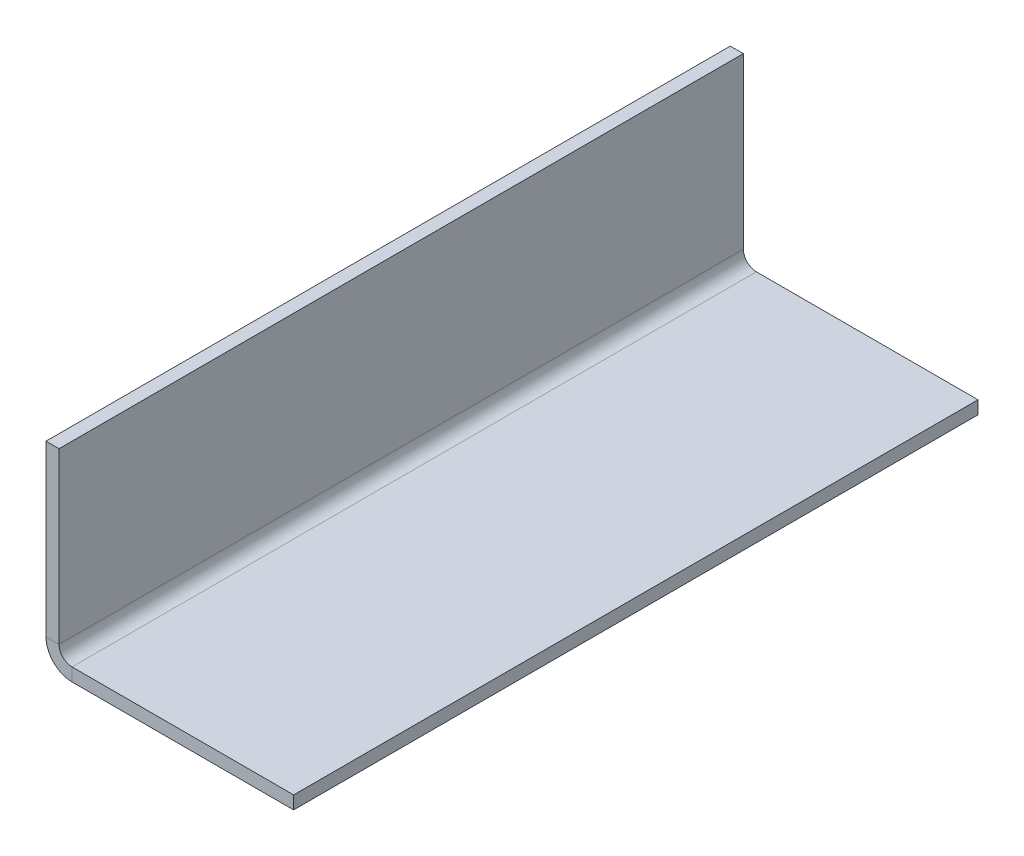
ISO-10303-21;
HEADER;
FILE_DESCRIPTION(('STEP AP214'),'2;1');
FILE_NAME('part.step','',(''),(''),'','','');
FILE_SCHEMA(('AUTOMOTIVE_DESIGN { 1 0 10303 214 1 1 1 1 }'));
ENDSEC;
DATA;
#1=APPLICATION_CONTEXT('core data for automotive mechanical design processes');
#2=APPLICATION_PROTOCOL_DEFINITION('international standard','automotive_design',2000,#1);
#3=PRODUCT_CONTEXT('',#1,'mechanical');
#4=PRODUCT('Part','Part','',(#3));
#5=PRODUCT_RELATED_PRODUCT_CATEGORY('part','',(#4));
#6=PRODUCT_DEFINITION_FORMATION('','',#4);
#7=PRODUCT_DEFINITION_CONTEXT('part definition',#1,'design');
#8=PRODUCT_DEFINITION('design','',#6,#7);
#9=PRODUCT_DEFINITION_SHAPE('','',#8);
#10=(LENGTH_UNIT() NAMED_UNIT(*) SI_UNIT(.MILLI.,.METRE.));
#11=(NAMED_UNIT(*) PLANE_ANGLE_UNIT() SI_UNIT($,.RADIAN.));
#12=(NAMED_UNIT(*) SI_UNIT($,.STERADIAN.) SOLID_ANGLE_UNIT());
#13=UNCERTAINTY_MEASURE_WITH_UNIT(LENGTH_MEASURE(1.E-05),#10,'distance_accuracy_value','');
#14=(GEOMETRIC_REPRESENTATION_CONTEXT(3) GLOBAL_UNCERTAINTY_ASSIGNED_CONTEXT((#13)) GLOBAL_UNIT_ASSIGNED_CONTEXT((#10,
#11,#12)) REPRESENTATION_CONTEXT('',''));
#15=CARTESIAN_POINT('',(0.,0.,0.));
#16=DIRECTION('',(0.,0.,1.));
#17=DIRECTION('',(1.,0.,0.));
#18=AXIS2_PLACEMENT_3D('',#15,#16,#17);
#19=CARTESIAN_POINT('',(4.00000000000001,-28.,105.));
#20=DIRECTION('',(0.,0.,1.));
#21=DIRECTION('',(1.,0.,0.));
#22=AXIS2_PLACEMENT_3D('',#19,#20,#21);
#23=PLANE('',#22);
#24=DIRECTION('',(0.,-1.,0.));
#25=VECTOR('',#24,1.);
#26=CARTESIAN_POINT('',(0.,0.,105.));
#27=LINE('',#26,#25);
#28=CARTESIAN_POINT('',(0.,0.,105.));
#29=VERTEX_POINT('',#28);
#30=CARTESIAN_POINT('',(0.,-26.,105.));
#31=VERTEX_POINT('',#30);
#32=EDGE_CURVE('E76',#29,#31,#27,.T.);
#33=ORIENTED_EDGE('',*,*,#32,.T.);
#34=DIRECTION('',(1.,0.,0.));
#35=VECTOR('',#34,1.);
#36=CARTESIAN_POINT('',(0.,-26.,105.));
#37=LINE('',#36,#35);
#38=CARTESIAN_POINT('',(2.,-26.,105.));
#39=VERTEX_POINT('',#38);
#40=EDGE_CURVE('E100',#31,#39,#37,.T.);
#41=ORIENTED_EDGE('',*,*,#40,.T.);
#42=DIRECTION('',(0.,-1.,0.));
#43=VECTOR('',#42,1.);
#44=CARTESIAN_POINT('',(2.00000000000001,0.,105.));
#45=LINE('',#44,#43);
#46=CARTESIAN_POINT('',(2.00000000000001,0.,105.));
#47=VERTEX_POINT('',#46);
#48=EDGE_CURVE('E86',#47,#39,#45,.T.);
#49=ORIENTED_EDGE('',*,*,#48,.F.);
#50=DIRECTION('',(1.,0.,0.));
#51=VECTOR('',#50,1.);
#52=CARTESIAN_POINT('',(0.,0.,105.));
#53=LINE('',#52,#51);
#54=EDGE_CURVE('E167',#29,#47,#53,.T.);
#55=ORIENTED_EDGE('',*,*,#54,.F.);
#56=EDGE_LOOP('',(#33,#41,#49,#55));
#57=FACE_BOUND('',#56,.T.);
#58=ADVANCED_FACE('F38',(#57),#23,.T.);
#59=CARTESIAN_POINT('',(2.00000000000001,0.,105.));
#60=DIRECTION('',(1.,0.,0.));
#61=DIRECTION('',(0.,1.,0.));
#62=AXIS2_PLACEMENT_3D('',#59,#60,#61);
#63=PLANE('',#62);
#64=DIRECTION('',(0.,-1.,0.));
#65=VECTOR('',#64,1.);
#66=CARTESIAN_POINT('',(2.00000000000001,0.,0.));
#67=LINE('',#66,#65);
#68=CARTESIAN_POINT('',(2.00000000000001,0.,0.));
#69=VERTEX_POINT('',#68);
#70=CARTESIAN_POINT('',(2.,-26.,0.));
#71=VERTEX_POINT('',#70);
#72=EDGE_CURVE('E90',#69,#71,#67,.T.);
#73=ORIENTED_EDGE('',*,*,#72,.F.);
#74=DIRECTION('',(0.,0.,-1.));
#75=VECTOR('',#74,1.);
#76=CARTESIAN_POINT('',(2.00000000000001,0.,105.));
#77=LINE('',#76,#75);
#78=EDGE_CURVE('E78',#47,#69,#77,.T.);
#79=ORIENTED_EDGE('',*,*,#78,.F.);
#80=ORIENTED_EDGE('',*,*,#48,.T.);
#81=DIRECTION('',(0.,0.,-1.));
#82=VECTOR('',#81,1.);
#83=CARTESIAN_POINT('',(2.00000000000001,-26.,105.));
#84=LINE('',#83,#82);
#85=EDGE_CURVE('E97',#39,#71,#84,.T.);
#86=ORIENTED_EDGE('',*,*,#85,.T.);
#87=EDGE_LOOP('',(#73,#79,#80,#86));
#88=FACE_BOUND('',#87,.T.);
#89=ADVANCED_FACE('F169',(#88),#63,.T.);
#90=CARTESIAN_POINT('',(0.,0.,105.));
#91=DIRECTION('',(0.,1.,0.));
#92=DIRECTION('',(-1.,0.,0.));
#93=AXIS2_PLACEMENT_3D('',#90,#91,#92);
#94=PLANE('',#93);
#95=DIRECTION('',(1.,0.,0.));
#96=VECTOR('',#95,1.);
#97=CARTESIAN_POINT('',(0.,0.,0.));
#98=LINE('',#97,#96);
#99=CARTESIAN_POINT('',(0.,0.,0.));
#100=VERTEX_POINT('',#99);
#101=EDGE_CURVE('E84',#100,#69,#98,.T.);
#102=ORIENTED_EDGE('',*,*,#101,.F.);
#103=DIRECTION('',(0.,0.,-1.));
#104=VECTOR('',#103,1.);
#105=CARTESIAN_POINT('',(0.,0.,105.));
#106=LINE('',#105,#104);
#107=EDGE_CURVE('E60',#29,#100,#106,.T.);
#108=ORIENTED_EDGE('',*,*,#107,.F.);
#109=ORIENTED_EDGE('',*,*,#54,.T.);
#110=ORIENTED_EDGE('',*,*,#78,.T.);
#111=EDGE_LOOP('',(#102,#108,#109,#110));
#112=FACE_BOUND('',#111,.T.);
#113=ADVANCED_FACE('F88',(#112),#94,.T.);
#114=CARTESIAN_POINT('',(0.,0.,105.));
#115=DIRECTION('',(1.,0.,0.));
#116=DIRECTION('',(0.,1.,0.));
#117=AXIS2_PLACEMENT_3D('',#114,#115,#116);
#118=PLANE('',#117);
#119=DIRECTION('',(0.,-1.,0.));
#120=VECTOR('',#119,1.);
#121=CARTESIAN_POINT('',(0.,0.,0.));
#122=LINE('',#121,#120);
#123=CARTESIAN_POINT('',(0.,-26.,0.));
#124=VERTEX_POINT('',#123);
#125=EDGE_CURVE('E74',#100,#124,#122,.T.);
#126=ORIENTED_EDGE('',*,*,#125,.T.);
#127=DIRECTION('',(0.,0.,-1.));
#128=VECTOR('',#127,1.);
#129=CARTESIAN_POINT('',(0.,-26.,105.));
#130=LINE('',#129,#128);
#131=EDGE_CURVE('E45',#31,#124,#130,.T.);
#132=ORIENTED_EDGE('',*,*,#131,.F.);
#133=ORIENTED_EDGE('',*,*,#32,.F.);
#134=ORIENTED_EDGE('',*,*,#107,.T.);
#135=EDGE_LOOP('',(#126,#132,#133,#134));
#136=FACE_BOUND('',#135,.T.);
#137=ADVANCED_FACE('F73',(#136),#118,.F.);
#138=CARTESIAN_POINT('',(4.00000000000001,-26.,0.));
#139=DIRECTION('',(0.,0.,1.));
#140=DIRECTION('',(1.,0.,0.));
#141=AXIS2_PLACEMENT_3D('',#138,#139,#140);
#142=PLANE('',#141);
#143=ORIENTED_EDGE('',*,*,#72,.T.);
#144=DIRECTION('',(-1.,0.,0.));
#145=VECTOR('',#144,1.);
#146=CARTESIAN_POINT('',(2.00000000000001,-26.,0.));
#147=LINE('',#146,#145);
#148=EDGE_CURVE('E11',#71,#124,#147,.T.);
#149=ORIENTED_EDGE('',*,*,#148,.T.);
#150=ORIENTED_EDGE('',*,*,#125,.F.);
#151=ORIENTED_EDGE('',*,*,#101,.T.);
#152=EDGE_LOOP('',(#143,#149,#150,#151));
#153=FACE_BOUND('',#152,.T.);
#154=ADVANCED_FACE('F83',(#153),#142,.F.);
#155=CARTESIAN_POINT('',(38.,-28.,105.));
#156=DIRECTION('',(1.,0.,0.));
#157=DIRECTION('',(0.,0.,-1.));
#158=AXIS2_PLACEMENT_3D('',#155,#156,#157);
#159=PLANE('',#158);
#160=DIRECTION('',(0.,-1.,0.));
#161=VECTOR('',#160,1.);
#162=CARTESIAN_POINT('',(38.,-28.,0.));
#163=LINE('',#162,#161);
#164=CARTESIAN_POINT('',(38.,-28.,0.));
#165=VERTEX_POINT('',#164);
#166=CARTESIAN_POINT('',(38.,-30.,0.));
#167=VERTEX_POINT('',#166);
#168=EDGE_CURVE('E92',#165,#167,#163,.T.);
#169=ORIENTED_EDGE('',*,*,#168,.F.);
#170=DIRECTION('',(0.,0.,-1.));
#171=VECTOR('',#170,1.);
#172=CARTESIAN_POINT('',(38.,-28.,105.));
#173=LINE('',#172,#171);
#174=CARTESIAN_POINT('',(38.,-28.,105.));
#175=VERTEX_POINT('',#174);
#176=EDGE_CURVE('E150',#175,#165,#173,.T.);
#177=ORIENTED_EDGE('',*,*,#176,.F.);
#178=DIRECTION('',(0.,-1.,0.));
#179=VECTOR('',#178,1.);
#180=CARTESIAN_POINT('',(38.,-28.,105.));
#181=LINE('',#180,#179);
#182=CARTESIAN_POINT('',(38.,-30.,105.));
#183=VERTEX_POINT('',#182);
#184=EDGE_CURVE('E159',#175,#183,#181,.T.);
#185=ORIENTED_EDGE('',*,*,#184,.T.);
#186=DIRECTION('',(0.,0.,-1.));
#187=VECTOR('',#186,1.);
#188=CARTESIAN_POINT('',(38.,-30.,105.));
#189=LINE('',#188,#187);
#190=EDGE_CURVE('E156',#183,#167,#189,.T.);
#191=ORIENTED_EDGE('',*,*,#190,.T.);
#192=EDGE_LOOP('',(#169,#177,#185,#191));
#193=FACE_BOUND('',#192,.T.);
#194=ADVANCED_FACE('F191',(#193),#159,.T.);
#195=CARTESIAN_POINT('',(0.,-28.,105.));
#196=DIRECTION('',(0.,1.,0.));
#197=DIRECTION('',(0.,0.,1.));
#198=AXIS2_PLACEMENT_3D('',#195,#196,#197);
#199=PLANE('',#198);
#200=DIRECTION('',(1.,0.,0.));
#201=VECTOR('',#200,1.);
#202=CARTESIAN_POINT('',(0.,-28.,0.));
#203=LINE('',#202,#201);
#204=CARTESIAN_POINT('',(4.,-28.,0.));
#205=VERTEX_POINT('',#204);
#206=EDGE_CURVE('E134',#205,#165,#203,.T.);
#207=ORIENTED_EDGE('',*,*,#206,.F.);
#208=DIRECTION('',(0.,0.,-1.));
#209=VECTOR('',#208,1.);
#210=CARTESIAN_POINT('',(4.,-28.,105.));
#211=LINE('',#210,#209);
#212=CARTESIAN_POINT('',(4.,-28.,105.));
#213=VERTEX_POINT('',#212);
#214=EDGE_CURVE('E162',#213,#205,#211,.T.);
#215=ORIENTED_EDGE('',*,*,#214,.F.);
#216=DIRECTION('',(1.,0.,0.));
#217=VECTOR('',#216,1.);
#218=CARTESIAN_POINT('',(0.,-28.,105.));
#219=LINE('',#218,#217);
#220=EDGE_CURVE('E153',#213,#175,#219,.T.);
#221=ORIENTED_EDGE('',*,*,#220,.T.);
#222=ORIENTED_EDGE('',*,*,#176,.T.);
#223=EDGE_LOOP('',(#207,#215,#221,#222));
#224=FACE_BOUND('',#223,.T.);
#225=ADVANCED_FACE('F199',(#224),#199,.T.);
#226=CARTESIAN_POINT('',(4.,-26.,105.));
#227=DIRECTION('',(0.,0.,1.));
#228=DIRECTION('',(1.,0.,0.));
#229=AXIS2_PLACEMENT_3D('',#226,#227,#228);
#230=PLANE('',#229);
#231=DIRECTION('',(1.,0.,0.));
#232=VECTOR('',#231,1.);
#233=CARTESIAN_POINT('',(0.,-30.,105.));
#234=LINE('',#233,#232);
#235=CARTESIAN_POINT('',(4.,-30.,105.));
#236=VERTEX_POINT('',#235);
#237=EDGE_CURVE('E147',#236,#183,#234,.T.);
#238=ORIENTED_EDGE('',*,*,#237,.T.);
#239=ORIENTED_EDGE('',*,*,#184,.F.);
#240=ORIENTED_EDGE('',*,*,#220,.F.);
#241=DIRECTION('',(0.,-1.,0.));
#242=VECTOR('',#241,1.);
#243=CARTESIAN_POINT('',(4.,-28.,105.));
#244=LINE('',#243,#242);
#245=EDGE_CURVE('E144',#213,#236,#244,.T.);
#246=ORIENTED_EDGE('',*,*,#245,.T.);
#247=EDGE_LOOP('',(#238,#239,#240,#246));
#248=FACE_BOUND('',#247,.T.);
#249=ADVANCED_FACE('F196',(#248),#230,.T.);
#250=CARTESIAN_POINT('',(0.,-30.,105.));
#251=DIRECTION('',(0.,1.,0.));
#252=DIRECTION('',(0.,0.,1.));
#253=AXIS2_PLACEMENT_3D('',#250,#251,#252);
#254=PLANE('',#253);
#255=DIRECTION('',(1.,0.,0.));
#256=VECTOR('',#255,1.);
#257=CARTESIAN_POINT('',(0.,-30.,0.));
#258=LINE('',#257,#256);
#259=CARTESIAN_POINT('',(4.,-30.,0.));
#260=VERTEX_POINT('',#259);
#261=EDGE_CURVE('E141',#260,#167,#258,.T.);
#262=ORIENTED_EDGE('',*,*,#261,.T.);
#263=ORIENTED_EDGE('',*,*,#190,.F.);
#264=ORIENTED_EDGE('',*,*,#237,.F.);
#265=DIRECTION('',(0.,0.,-1.));
#266=VECTOR('',#265,1.);
#267=CARTESIAN_POINT('',(4.,-30.,105.));
#268=LINE('',#267,#266);
#269=EDGE_CURVE('E125',#236,#260,#268,.T.);
#270=ORIENTED_EDGE('',*,*,#269,.T.);
#271=EDGE_LOOP('',(#262,#263,#264,#270));
#272=FACE_BOUND('',#271,.T.);
#273=ADVANCED_FACE('F208',(#272),#254,.F.);
#274=CARTESIAN_POINT('',(2.,-26.,0.));
#275=DIRECTION('',(0.,0.,-1.));
#276=DIRECTION('',(-1.,0.,0.));
#277=AXIS2_PLACEMENT_3D('',#274,#275,#276);
#278=PLANE('',#277);
#279=ORIENTED_EDGE('',*,*,#261,.F.);
#280=DIRECTION('',(0.,1.,0.));
#281=VECTOR('',#280,1.);
#282=CARTESIAN_POINT('',(4.,-30.,0.));
#283=LINE('',#282,#281);
#284=EDGE_CURVE('E137',#260,#205,#283,.T.);
#285=ORIENTED_EDGE('',*,*,#284,.T.);
#286=ORIENTED_EDGE('',*,*,#206,.T.);
#287=ORIENTED_EDGE('',*,*,#168,.T.);
#288=EDGE_LOOP('',(#279,#285,#286,#287));
#289=FACE_BOUND('',#288,.T.);
#290=ADVANCED_FACE('F206',(#289),#278,.T.);
#291=CARTESIAN_POINT('',(4.,-26.,105.));
#292=DIRECTION('',(0.,0.,-1.));
#293=DIRECTION('',(-1.,0.,0.));
#294=AXIS2_PLACEMENT_3D('',#291,#292,#293);
#295=PLANE('',#294);
#296=ORIENTED_EDGE('',*,*,#40,.F.);
#297=CARTESIAN_POINT('',(4.,-26.,105.));
#298=DIRECTION('',(0.,0.,1.));
#299=DIRECTION('',(1.,0.,0.));
#300=AXIS2_PLACEMENT_3D('',#297,#298,#299);
#301=CIRCLE('',#300,4.);
#302=EDGE_CURVE('E117',#31,#236,#301,.T.);
#303=ORIENTED_EDGE('',*,*,#302,.T.);
#304=ORIENTED_EDGE('',*,*,#245,.F.);
#305=CARTESIAN_POINT('',(4.,-26.,105.));
#306=DIRECTION('',(0.,0.,1.));
#307=DIRECTION('',(1.,0.,0.));
#308=AXIS2_PLACEMENT_3D('',#305,#306,#307);
#309=CIRCLE('',#308,2.);
#310=EDGE_CURVE('E120',#39,#213,#309,.T.);
#311=ORIENTED_EDGE('',*,*,#310,.F.);
#312=EDGE_LOOP('',(#296,#303,#304,#311));
#313=FACE_BOUND('',#312,.T.);
#314=ADVANCED_FACE('F114',(#313),#295,.F.);
#315=CARTESIAN_POINT('',(4.,-26.,0.));
#316=DIRECTION('',(0.,0.,1.));
#317=DIRECTION('',(1.,0.,0.));
#318=AXIS2_PLACEMENT_3D('',#315,#316,#317);
#319=PLANE('',#318);
#320=ORIENTED_EDGE('',*,*,#284,.F.);
#321=CARTESIAN_POINT('',(4.,-26.,0.));
#322=DIRECTION('',(0.,0.,1.));
#323=DIRECTION('',(1.,0.,0.));
#324=AXIS2_PLACEMENT_3D('',#321,#322,#323);
#325=CIRCLE('',#324,4.);
#326=EDGE_CURVE('E127',#260,#124,#325,.F.);
#327=ORIENTED_EDGE('',*,*,#326,.T.);
#328=ORIENTED_EDGE('',*,*,#148,.F.);
#329=CARTESIAN_POINT('',(4.,-26.,0.));
#330=DIRECTION('',(0.,0.,-1.));
#331=DIRECTION('',(-1.,0.,0.));
#332=AXIS2_PLACEMENT_3D('',#329,#330,#331);
#333=CIRCLE('',#332,2.);
#334=EDGE_CURVE('E165',#205,#71,#333,.T.);
#335=ORIENTED_EDGE('',*,*,#334,.F.);
#336=EDGE_LOOP('',(#320,#327,#328,#335));
#337=FACE_BOUND('',#336,.T.);
#338=ADVANCED_FACE('F202',(#337),#319,.F.);
#339=CARTESIAN_POINT('',(4.,-26.,-52.595202171377));
#340=DIRECTION('',(0.,0.,1.));
#341=DIRECTION('',(1.,0.,0.));
#342=AXIS2_PLACEMENT_3D('',#339,#340,#341);
#343=CYLINDRICAL_SURFACE('',#342,2.);
#344=ORIENTED_EDGE('',*,*,#334,.T.);
#345=ORIENTED_EDGE('',*,*,#85,.F.);
#346=ORIENTED_EDGE('',*,*,#310,.T.);
#347=ORIENTED_EDGE('',*,*,#214,.T.);
#348=EDGE_LOOP('',(#344,#345,#346,#347));
#349=FACE_BOUND('',#348,.T.);
#350=ADVANCED_FACE('F201',(#349),#343,.F.);
#351=CARTESIAN_POINT('',(4.,-26.,-52.595202171377));
#352=DIRECTION('',(0.,0.,1.));
#353=DIRECTION('',(1.,0.,0.));
#354=AXIS2_PLACEMENT_3D('',#351,#352,#353);
#355=CYLINDRICAL_SURFACE('',#354,4.);
#356=ORIENTED_EDGE('',*,*,#326,.F.);
#357=ORIENTED_EDGE('',*,*,#269,.F.);
#358=ORIENTED_EDGE('',*,*,#302,.F.);
#359=ORIENTED_EDGE('',*,*,#131,.T.);
#360=EDGE_LOOP('',(#356,#357,#358,#359));
#361=FACE_BOUND('',#360,.T.);
#362=ADVANCED_FACE('F123',(#361),#355,.T.);
#363=CLOSED_SHELL('',(#58,#89,#113,#137,#154,#194,#225,#249,#273,#290,#314,#338,#350,#362));
#364=MANIFOLD_SOLID_BREP('B2',#363);
#365=ADVANCED_BREP_SHAPE_REPRESENTATION('',(#18,#364),#14);
#366=SHAPE_DEFINITION_REPRESENTATION(#9,#365);
ENDSEC;
END-ISO-10303-21;
